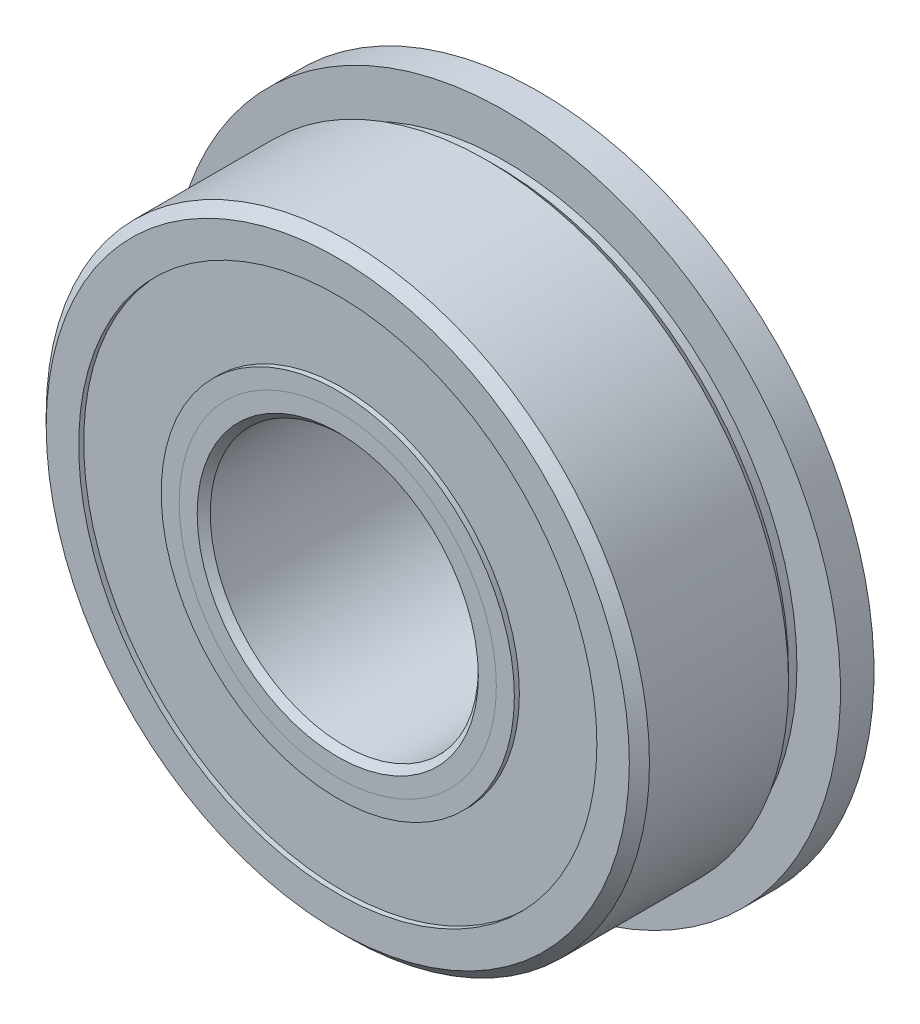
ISO-10303-21;
HEADER;
FILE_DESCRIPTION(('STEP AP214'),'2;1');
FILE_NAME('part.step','',(''),(''),'','','');
FILE_SCHEMA(('AUTOMOTIVE_DESIGN { 1 0 10303 214 1 1 1 1 }'));
ENDSEC;
DATA;
#1=APPLICATION_CONTEXT('core data for automotive mechanical design processes');
#2=APPLICATION_PROTOCOL_DEFINITION('international standard','automotive_design',2000,#1);
#3=PRODUCT_CONTEXT('',#1,'mechanical');
#4=PRODUCT('Part','Part','',(#3));
#5=PRODUCT_RELATED_PRODUCT_CATEGORY('part','',(#4));
#6=PRODUCT_DEFINITION_FORMATION('','',#4);
#7=PRODUCT_DEFINITION_CONTEXT('part definition',#1,'design');
#8=PRODUCT_DEFINITION('design','',#6,#7);
#9=PRODUCT_DEFINITION_SHAPE('','',#8);
#10=(LENGTH_UNIT() NAMED_UNIT(*) SI_UNIT(.MILLI.,.METRE.));
#11=(NAMED_UNIT(*) PLANE_ANGLE_UNIT() SI_UNIT($,.RADIAN.));
#12=(NAMED_UNIT(*) SI_UNIT($,.STERADIAN.) SOLID_ANGLE_UNIT());
#13=UNCERTAINTY_MEASURE_WITH_UNIT(LENGTH_MEASURE(1.E-05),#10,'distance_accuracy_value','');
#14=(GEOMETRIC_REPRESENTATION_CONTEXT(3) GLOBAL_UNCERTAINTY_ASSIGNED_CONTEXT((#13)) GLOBAL_UNIT_ASSIGNED_CONTEXT((#10,
#11,#12)) REPRESENTATION_CONTEXT('',''));
#15=CARTESIAN_POINT('',(0.,0.,0.));
#16=DIRECTION('',(0.,0.,1.));
#17=DIRECTION('',(1.,0.,0.));
#18=AXIS2_PLACEMENT_3D('',#15,#16,#17);
#19=CARTESIAN_POINT('',(0.,0.,4.7625));
#20=DIRECTION('',(0.,0.,1.));
#21=DIRECTION('',(1.,0.,0.));
#22=AXIS2_PLACEMENT_3D('',#19,#20,#21);
#23=CYLINDRICAL_SURFACE('',#22,8.7376);
#24=CARTESIAN_POINT('',(0.,0.,-3.35017734788581));
#25=DIRECTION('',(0.,0.,1.));
#26=DIRECTION('',(1.,0.,0.));
#27=AXIS2_PLACEMENT_3D('',#24,#25,#26);
#28=CIRCLE('',#27,8.7376);
#29=CARTESIAN_POINT('',(8.7376,0.,-3.35017734788581));
#30=VERTEX_POINT('',#29);
#31=EDGE_CURVE('E11',#30,#30,#28,.T.);
#32=ORIENTED_EDGE('',*,*,#31,.T.);
#33=EDGE_LOOP('',(#32));
#34=FACE_BOUND('',#33,.T.);
#35=CARTESIAN_POINT('',(0.,0.,-4.270375));
#36=DIRECTION('',(0.,0.,-1.));
#37=DIRECTION('',(-1.,0.,0.));
#38=AXIS2_PLACEMENT_3D('',#35,#36,#37);
#39=CIRCLE('',#38,8.7376);
#40=CARTESIAN_POINT('',(-8.7376,0.,-4.270375));
#41=VERTEX_POINT('',#40);
#42=EDGE_CURVE('E75',#41,#41,#39,.T.);
#43=ORIENTED_EDGE('',*,*,#42,.T.);
#44=EDGE_LOOP('',(#43));
#45=FACE_BOUND('',#44,.T.);
#46=ADVANCED_FACE('F54',(#34,#45),#23,.F.);
#47=CARTESIAN_POINT('',(0.,12.2725961538462,-4.524375));
#48=DIRECTION('',(0.,0.,1.));
#49=DIRECTION('',(1.,0.,0.));
#50=AXIS2_PLACEMENT_3D('',#47,#48,#49);
#51=PLANE('',#50);
#52=CARTESIAN_POINT('',(0.,0.,-4.524375));
#53=DIRECTION('',(0.,0.,-1.));
#54=DIRECTION('',(-1.,0.,0.));
#55=AXIS2_PLACEMENT_3D('',#52,#53,#54);
#56=CIRCLE('',#55,9.436608);
#57=CARTESIAN_POINT('',(-9.436608,0.,-4.524375));
#58=VERTEX_POINT('',#57);
#59=EDGE_CURVE('E72',#58,#58,#56,.T.);
#60=ORIENTED_EDGE('',*,*,#59,.F.);
#61=EDGE_LOOP('',(#60));
#62=FACE_BOUND('',#61,.T.);
#63=CARTESIAN_POINT('',(0.,0.,-4.524375));
#64=DIRECTION('',(0.,0.,1.));
#65=DIRECTION('',(1.,0.,0.));
#66=AXIS2_PLACEMENT_3D('',#63,#64,#65);
#67=CIRCLE('',#66,12.2725961538462);
#68=CARTESIAN_POINT('',(12.2725961538462,0.,-4.524375));
#69=VERTEX_POINT('',#68);
#70=EDGE_CURVE('E65',#69,#69,#67,.T.);
#71=ORIENTED_EDGE('',*,*,#70,.F.);
#72=EDGE_LOOP('',(#71));
#73=FACE_BOUND('',#72,.T.);
#74=ADVANCED_FACE('F56',(#62,#73),#51,.F.);
#75=CARTESIAN_POINT('',(0.,12.2725961538462,-3.35017734788581));
#76=DIRECTION('',(0.,0.,-1.));
#77=DIRECTION('',(-1.,0.,0.));
#78=AXIS2_PLACEMENT_3D('',#75,#76,#77);
#79=PLANE('',#78);
#80=ORIENTED_EDGE('',*,*,#31,.F.);
#81=EDGE_LOOP('',(#80));
#82=FACE_BOUND('',#81,.T.);
#83=CARTESIAN_POINT('',(0.,0.,-3.35017734788581));
#84=DIRECTION('',(0.,0.,1.));
#85=DIRECTION('',(1.,0.,0.));
#86=AXIS2_PLACEMENT_3D('',#83,#84,#85);
#87=CIRCLE('',#86,12.2725961538462);
#88=CARTESIAN_POINT('',(12.2725961538462,0.,-3.35017734788581));
#89=VERTEX_POINT('',#88);
#90=EDGE_CURVE('E61',#89,#89,#87,.T.);
#91=ORIENTED_EDGE('',*,*,#90,.T.);
#92=EDGE_LOOP('',(#91));
#93=FACE_BOUND('',#92,.T.);
#94=ADVANCED_FACE('F97',(#82,#93),#79,.F.);
#95=CARTESIAN_POINT('',(0.,0.,4.7625));
#96=DIRECTION('',(0.,0.,1.));
#97=DIRECTION('',(1.,0.,0.));
#98=AXIS2_PLACEMENT_3D('',#95,#96,#97);
#99=CYLINDRICAL_SURFACE('',#98,12.2725961538462);
#100=ORIENTED_EDGE('',*,*,#90,.F.);
#101=EDGE_LOOP('',(#100));
#102=FACE_BOUND('',#101,.T.);
#103=ORIENTED_EDGE('',*,*,#70,.T.);
#104=EDGE_LOOP('',(#103));
#105=FACE_BOUND('',#104,.T.);
#106=ADVANCED_FACE('F91',(#102,#105),#99,.T.);
#107=CARTESIAN_POINT('',(0.,0.,-4.270375));
#108=DIRECTION('',(0.,0.,-1.));
#109=DIRECTION('',(-1.,0.,0.));
#110=AXIS2_PLACEMENT_3D('',#107,#108,#109);
#111=CYLINDRICAL_SURFACE('',#110,9.436608);
#112=CARTESIAN_POINT('',(0.,0.,-4.270375));
#113=DIRECTION('',(0.,0.,-1.));
#114=DIRECTION('',(-1.,0.,0.));
#115=AXIS2_PLACEMENT_3D('',#112,#113,#114);
#116=CIRCLE('',#115,9.436608);
#117=CARTESIAN_POINT('',(-9.436608,0.,-4.270375));
#118=VERTEX_POINT('',#117);
#119=EDGE_CURVE('E69',#118,#118,#116,.T.);
#120=ORIENTED_EDGE('',*,*,#119,.F.);
#121=EDGE_LOOP('',(#120));
#122=FACE_BOUND('',#121,.T.);
#123=ORIENTED_EDGE('',*,*,#59,.T.);
#124=EDGE_LOOP('',(#123));
#125=FACE_BOUND('',#124,.T.);
#126=ADVANCED_FACE('F85',(#122,#125),#111,.F.);
#127=CARTESIAN_POINT('',(0.,0.,-4.270375));
#128=DIRECTION('',(0.,0.,-1.));
#129=DIRECTION('',(-1.,0.,0.));
#130=AXIS2_PLACEMENT_3D('',#127,#128,#129);
#131=PLANE('',#130);
#132=ORIENTED_EDGE('',*,*,#42,.F.);
#133=EDGE_LOOP('',(#132));
#134=FACE_BOUND('',#133,.T.);
#135=ORIENTED_EDGE('',*,*,#119,.T.);
#136=EDGE_LOOP('',(#135));
#137=FACE_BOUND('',#136,.T.);
#138=ADVANCED_FACE('F82',(#134,#137),#131,.T.);
#139=CLOSED_SHELL('',(#46,#74,#94,#106,#126,#138));
#140=MANIFOLD_SOLID_BREP('B2',#139);
#141=CARTESIAN_POINT('',(0.,12.2725961538462,4.524375));
#142=DIRECTION('',(0.,0.,-1.));
#143=DIRECTION('',(-1.,0.,0.));
#144=AXIS2_PLACEMENT_3D('',#141,#142,#143);
#145=PLANE('',#144);
#146=CARTESIAN_POINT('',(0.,0.,4.524375));
#147=DIRECTION('',(0.,0.,1.));
#148=DIRECTION('',(1.,0.,0.));
#149=AXIS2_PLACEMENT_3D('',#146,#147,#148);
#150=CIRCLE('',#149,8.36490384615385);
#151=CARTESIAN_POINT('',(8.36490384615385,0.,4.524375));
#152=VERTEX_POINT('',#151);
#153=EDGE_CURVE('E53',#152,#152,#150,.T.);
#154=ORIENTED_EDGE('',*,*,#153,.F.);
#155=EDGE_LOOP('',(#154));
#156=FACE_BOUND('',#155,.T.);
#157=CARTESIAN_POINT('',(0.,0.,4.524375));
#158=DIRECTION('',(0.,0.,1.));
#159=DIRECTION('',(1.,0.,0.));
#160=AXIS2_PLACEMENT_3D('',#157,#158,#159);
#161=CIRCLE('',#160,12.2725961538462);
#162=CARTESIAN_POINT('',(12.2725961538462,0.,4.524375));
#163=VERTEX_POINT('',#162);
#164=EDGE_CURVE('E182',#163,#163,#161,.T.);
#165=ORIENTED_EDGE('',*,*,#164,.T.);
#166=EDGE_LOOP('',(#165));
#167=FACE_BOUND('',#166,.T.);
#168=ADVANCED_FACE('F168',(#156,#167),#145,.F.);
#169=CARTESIAN_POINT('',(0.,0.,4.7625));
#170=DIRECTION('',(0.,0.,1.));
#171=DIRECTION('',(1.,0.,0.));
#172=AXIS2_PLACEMENT_3D('',#169,#170,#171);
#173=CYLINDRICAL_SURFACE('',#172,8.36490384615385);
#174=CARTESIAN_POINT('',(0.,0.,3.3501773478858));
#175=DIRECTION('',(0.,0.,1.));
#176=DIRECTION('',(1.,0.,0.));
#177=AXIS2_PLACEMENT_3D('',#174,#175,#176);
#178=CIRCLE('',#177,8.36490384615385);
#179=CARTESIAN_POINT('',(8.36490384615385,0.,3.3501773478858));
#180=VERTEX_POINT('',#179);
#181=EDGE_CURVE('E174',#180,#180,#178,.T.);
#182=ORIENTED_EDGE('',*,*,#181,.F.);
#183=EDGE_LOOP('',(#182));
#184=FACE_BOUND('',#183,.T.);
#185=ORIENTED_EDGE('',*,*,#153,.T.);
#186=EDGE_LOOP('',(#185));
#187=FACE_BOUND('',#186,.T.);
#188=ADVANCED_FACE('F197',(#184,#187),#173,.F.);
#189=CARTESIAN_POINT('',(0.,12.2725961538462,3.3501773478858));
#190=DIRECTION('',(0.,0.,1.));
#191=DIRECTION('',(1.,0.,0.));
#192=AXIS2_PLACEMENT_3D('',#189,#190,#191);
#193=PLANE('',#192);
#194=CARTESIAN_POINT('',(0.,0.,3.35017734788581));
#195=DIRECTION('',(0.,0.,1.));
#196=DIRECTION('',(1.,0.,0.));
#197=AXIS2_PLACEMENT_3D('',#194,#195,#196);
#198=CIRCLE('',#197,12.2725961538462);
#199=CARTESIAN_POINT('',(12.2725961538462,0.,3.35017734788581));
#200=VERTEX_POINT('',#199);
#201=EDGE_CURVE('E178',#200,#200,#198,.T.);
#202=ORIENTED_EDGE('',*,*,#201,.F.);
#203=EDGE_LOOP('',(#202));
#204=FACE_BOUND('',#203,.T.);
#205=ORIENTED_EDGE('',*,*,#181,.T.);
#206=EDGE_LOOP('',(#205));
#207=FACE_BOUND('',#206,.T.);
#208=ADVANCED_FACE('F192',(#204,#207),#193,.F.);
#209=CARTESIAN_POINT('',(0.,0.,4.7625));
#210=DIRECTION('',(0.,0.,1.));
#211=DIRECTION('',(1.,0.,0.));
#212=AXIS2_PLACEMENT_3D('',#209,#210,#211);
#213=CYLINDRICAL_SURFACE('',#212,12.2725961538462);
#214=ORIENTED_EDGE('',*,*,#164,.F.);
#215=EDGE_LOOP('',(#214));
#216=FACE_BOUND('',#215,.T.);
#217=ORIENTED_EDGE('',*,*,#201,.T.);
#218=EDGE_LOOP('',(#217));
#219=FACE_BOUND('',#218,.T.);
#220=ADVANCED_FACE('F189',(#216,#219),#213,.T.);
#221=CLOSED_SHELL('',(#168,#188,#208,#220));
#222=MANIFOLD_SOLID_BREP('B6',#221);
#223=CARTESIAN_POINT('',(-5.15937499999989,8.93629963530074,0.));
#224=DIRECTION('',(0.,0.,1.));
#225=DIRECTION('',(-0.499999999999989,0.866025403784445,0.));
#226=AXIS2_PLACEMENT_3D('',#223,#224,#225);
#227=SPHERICAL_SURFACE('',#226,3.3501773478858);
#228=CARTESIAN_POINT('',(-5.15937499999989,8.93629963530074,3.3501773478858));
#229=VERTEX_POINT('',#228);
#230=VERTEX_LOOP('',#229);
#231=FACE_BOUND('',#230,.T.);
#232=ADVANCED_FACE('F234',(#231),#227,.T.);
#233=CLOSED_SHELL('',(#232));
#234=MANIFOLD_SOLID_BREP('B48',#233);
#235=CARTESIAN_POINT('',(-8.93629963530062,5.1593750000001,0.));
#236=DIRECTION('',(0.,0.,1.));
#237=DIRECTION('',(-0.866025403784433,0.50000000000001,0.));
#238=AXIS2_PLACEMENT_3D('',#235,#236,#237);
#239=SPHERICAL_SURFACE('',#238,3.3501773478858);
#240=CARTESIAN_POINT('',(-8.93629963530062,5.1593750000001,3.3501773478858));
#241=VERTEX_POINT('',#240);
#242=VERTEX_LOOP('',#241);
#243=FACE_BOUND('',#242,.T.);
#244=ADVANCED_FACE('F273',(#243),#239,.T.);
#245=CLOSED_SHELL('',(#244));
#246=MANIFOLD_SOLID_BREP('B164',#245);
#247=CARTESIAN_POINT('',(-10.31875,1.08083169195563E-13,0.));
#248=DIRECTION('',(0.,0.,1.));
#249=DIRECTION('',(-1.,0.,0.));
#250=AXIS2_PLACEMENT_3D('',#247,#248,#249);
#251=SPHERICAL_SURFACE('',#250,3.3501773478858);
#252=CARTESIAN_POINT('',(-10.31875,1.08083169195563E-13,3.3501773478858));
#253=VERTEX_POINT('',#252);
#254=VERTEX_LOOP('',#253);
#255=FACE_BOUND('',#254,.T.);
#256=ADVANCED_FACE('F312',(#255),#251,.T.);
#257=CLOSED_SHELL('',(#256));
#258=MANIFOLD_SOLID_BREP('B230',#257);
#259=CARTESIAN_POINT('',(-8.93629963530072,-5.15937499999992,0.));
#260=DIRECTION('',(0.,0.,1.));
#261=DIRECTION('',(-0.866025403784443,-0.499999999999992,0.));
#262=AXIS2_PLACEMENT_3D('',#259,#260,#261);
#263=SPHERICAL_SURFACE('',#262,3.3501773478858);
#264=CARTESIAN_POINT('',(-8.93629963530072,-5.15937499999992,3.3501773478858));
#265=VERTEX_POINT('',#264);
#266=VERTEX_LOOP('',#265);
#267=FACE_BOUND('',#266,.T.);
#268=ADVANCED_FACE('F351',(#267),#263,.T.);
#269=CLOSED_SHELL('',(#268));
#270=MANIFOLD_SOLID_BREP('B269',#269);
#271=CARTESIAN_POINT('',(-5.15937500000007,-8.93629963530064,0.));
#272=DIRECTION('',(0.,0.,1.));
#273=DIRECTION('',(-0.500000000000007,-0.866025403784435,0.));
#274=AXIS2_PLACEMENT_3D('',#271,#272,#273);
#275=SPHERICAL_SURFACE('',#274,3.3501773478858);
#276=CARTESIAN_POINT('',(-5.15937500000007,-8.93629963530064,3.3501773478858));
#277=VERTEX_POINT('',#276);
#278=VERTEX_LOOP('',#277);
#279=FACE_BOUND('',#278,.T.);
#280=ADVANCED_FACE('F390',(#279),#275,.T.);
#281=CLOSED_SHELL('',(#280));
#282=MANIFOLD_SOLID_BREP('B308',#281);
#283=CARTESIAN_POINT('',(0.,-10.31875,0.));
#284=DIRECTION('',(0.,0.,1.));
#285=DIRECTION('',(0.,-1.,0.));
#286=AXIS2_PLACEMENT_3D('',#283,#284,#285);
#287=SPHERICAL_SURFACE('',#286,3.3501773478858);
#288=CARTESIAN_POINT('',(0.,-10.31875,3.3501773478858));
#289=VERTEX_POINT('',#288);
#290=VERTEX_LOOP('',#289);
#291=FACE_BOUND('',#290,.T.);
#292=ADVANCED_FACE('F431',(#291),#287,.T.);
#293=CLOSED_SHELL('',(#292));
#294=MANIFOLD_SOLID_BREP('B347',#293);
#295=CARTESIAN_POINT('',(5.15937499999995,-8.93629963530071,0.));
#296=DIRECTION('',(0.,0.,1.));
#297=DIRECTION('',(0.499999999999995,-0.866025403784442,0.));
#298=AXIS2_PLACEMENT_3D('',#295,#296,#297);
#299=SPHERICAL_SURFACE('',#298,3.3501773478858);
#300=CARTESIAN_POINT('',(5.15937499999995,-8.93629963530071,3.3501773478858));
#301=VERTEX_POINT('',#300);
#302=VERTEX_LOOP('',#301);
#303=FACE_BOUND('',#302,.T.);
#304=ADVANCED_FACE('F470',(#303),#299,.T.);
#305=CLOSED_SHELL('',(#304));
#306=MANIFOLD_SOLID_BREP('B386',#305);
#307=CARTESIAN_POINT('',(8.93629963530065,-5.15937500000004,0.));
#308=DIRECTION('',(0.,0.,1.));
#309=DIRECTION('',(0.866025403784436,-0.500000000000004,0.));
#310=AXIS2_PLACEMENT_3D('',#307,#308,#309);
#311=SPHERICAL_SURFACE('',#310,3.3501773478858);
#312=CARTESIAN_POINT('',(8.93629963530065,-5.15937500000004,3.3501773478858));
#313=VERTEX_POINT('',#312);
#314=VERTEX_LOOP('',#313);
#315=FACE_BOUND('',#314,.T.);
#316=ADVANCED_FACE('F509',(#315),#311,.T.);
#317=CLOSED_SHELL('',(#316));
#318=MANIFOLD_SOLID_BREP('B427',#317);
#319=CARTESIAN_POINT('',(10.31875,0.,0.));
#320=DIRECTION('',(0.,0.,1.));
#321=DIRECTION('',(1.,0.,0.));
#322=AXIS2_PLACEMENT_3D('',#319,#320,#321);
#323=SPHERICAL_SURFACE('',#322,3.3501773478858);
#324=CARTESIAN_POINT('',(10.31875,0.,3.3501773478858));
#325=VERTEX_POINT('',#324);
#326=VERTEX_LOOP('',#325);
#327=FACE_BOUND('',#326,.T.);
#328=ADVANCED_FACE('F548',(#327),#323,.T.);
#329=CLOSED_SHELL('',(#328));
#330=MANIFOLD_SOLID_BREP('B466',#329);
#331=CARTESIAN_POINT('',(8.93629963530069,5.15937499999998,0.));
#332=DIRECTION('',(0.,0.,1.));
#333=DIRECTION('',(0.86602540378444,0.499999999999998,0.));
#334=AXIS2_PLACEMENT_3D('',#331,#332,#333);
#335=SPHERICAL_SURFACE('',#334,3.3501773478858);
#336=CARTESIAN_POINT('',(8.93629963530069,5.15937499999998,3.3501773478858));
#337=VERTEX_POINT('',#336);
#338=VERTEX_LOOP('',#337);
#339=FACE_BOUND('',#338,.T.);
#340=ADVANCED_FACE('F587',(#339),#335,.T.);
#341=CLOSED_SHELL('',(#340));
#342=MANIFOLD_SOLID_BREP('B505',#341);
#343=CARTESIAN_POINT('',(5.15937500000001,8.93629963530067,0.));
#344=DIRECTION('',(0.,0.,1.));
#345=DIRECTION('',(0.500000000000001,0.866025403784438,0.));
#346=AXIS2_PLACEMENT_3D('',#343,#344,#345);
#347=SPHERICAL_SURFACE('',#346,3.3501773478858);
#348=CARTESIAN_POINT('',(5.15937500000001,8.93629963530067,3.3501773478858));
#349=VERTEX_POINT('',#348);
#350=VERTEX_LOOP('',#349);
#351=FACE_BOUND('',#350,.T.);
#352=ADVANCED_FACE('F626',(#351),#347,.T.);
#353=CLOSED_SHELL('',(#352));
#354=MANIFOLD_SOLID_BREP('B544',#353);
#355=CARTESIAN_POINT('',(0.,10.31875,0.));
#356=DIRECTION('',(0.,0.,1.));
#357=DIRECTION('',(0.,1.,0.));
#358=AXIS2_PLACEMENT_3D('',#355,#356,#357);
#359=SPHERICAL_SURFACE('',#358,3.3501773478858);
#360=CARTESIAN_POINT('',(0.,10.31875,3.3501773478858));
#361=VERTEX_POINT('',#360);
#362=VERTEX_LOOP('',#361);
#363=FACE_BOUND('',#362,.T.);
#364=ADVANCED_FACE('F667',(#363),#359,.T.);
#365=CLOSED_SHELL('',(#364));
#366=MANIFOLD_SOLID_BREP('B583',#365);
#367=CARTESIAN_POINT('',(0.,6.82625,-6.35));
#368=DIRECTION('',(0.,0.,1.));
#369=DIRECTION('',(1.,0.,0.));
#370=AXIS2_PLACEMENT_3D('',#367,#368,#369);
#371=PLANE('',#370);
#372=CARTESIAN_POINT('',(0.,0.,-6.35));
#373=DIRECTION('',(0.,0.,1.));
#374=DIRECTION('',(1.,0.,0.));
#375=AXIS2_PLACEMENT_3D('',#372,#373,#374);
#376=CIRCLE('',#375,6.82625);
#377=CARTESIAN_POINT('',(6.82625,0.,-6.35));
#378=VERTEX_POINT('',#377);
#379=EDGE_CURVE('E714',#378,#378,#376,.T.);
#380=ORIENTED_EDGE('',*,*,#379,.T.);
#381=EDGE_LOOP('',(#380));
#382=FACE_BOUND('',#381,.T.);
#383=CARTESIAN_POINT('',(0.,0.,-6.35));
#384=DIRECTION('',(0.,0.,-1.));
#385=DIRECTION('',(-1.,0.,0.));
#386=AXIS2_PLACEMENT_3D('',#383,#384,#385);
#387=CIRCLE('',#386,7.607173);
#388=CARTESIAN_POINT('',(-7.607173,0.,-6.35));
#389=VERTEX_POINT('',#388);
#390=EDGE_CURVE('E733',#389,#389,#387,.T.);
#391=ORIENTED_EDGE('',*,*,#390,.T.);
#392=EDGE_LOOP('',(#391));
#393=FACE_BOUND('',#392,.T.);
#394=ADVANCED_FACE('F688',(#382,#393),#371,.F.);
#395=CARTESIAN_POINT('',(0.,7.51209508610547,4.7625));
#396=DIRECTION('',(0.,0.,-1.));
#397=DIRECTION('',(-1.,0.,0.));
#398=AXIS2_PLACEMENT_3D('',#395,#396,#397);
#399=PLANE('',#398);
#400=CARTESIAN_POINT('',(0.,0.,4.7625));
#401=DIRECTION('',(0.,0.,1.));
#402=DIRECTION('',(1.,0.,0.));
#403=AXIS2_PLACEMENT_3D('',#400,#401,#402);
#404=CIRCLE('',#403,6.6592863260571);
#405=CARTESIAN_POINT('',(6.6592863260571,0.,4.7625));
#406=VERTEX_POINT('',#405);
#407=EDGE_CURVE('E723',#406,#406,#404,.T.);
#408=ORIENTED_EDGE('',*,*,#407,.F.);
#409=EDGE_LOOP('',(#408));
#410=FACE_BOUND('',#409,.T.);
#411=CARTESIAN_POINT('',(0.,0.,4.7625));
#412=DIRECTION('',(0.,0.,1.));
#413=DIRECTION('',(1.,0.,0.));
#414=AXIS2_PLACEMENT_3D('',#411,#412,#413);
#415=CIRCLE('',#414,7.51209508610547);
#416=CARTESIAN_POINT('',(7.51209508610547,0.,4.7625));
#417=VERTEX_POINT('',#416);
#418=EDGE_CURVE('E666',#417,#417,#415,.T.);
#419=ORIENTED_EDGE('',*,*,#418,.T.);
#420=EDGE_LOOP('',(#419));
#421=FACE_BOUND('',#420,.T.);
#422=ADVANCED_FACE('F690',(#410,#421),#399,.F.);
#423=CARTESIAN_POINT('',(0.,0.,3.90969123995163));
#424=DIRECTION('',(0.,0.,1.));
#425=DIRECTION('',(1.,0.,0.));
#426=AXIS2_PLACEMENT_3D('',#423,#424,#425);
#427=CONICAL_SURFACE('',#426,6.6592863260571,0.785398163397449);
#428=ORIENTED_EDGE('',*,*,#418,.F.);
#429=EDGE_LOOP('',(#428));
#430=FACE_BOUND('',#429,.T.);
#431=CARTESIAN_POINT('',(0.,0.,3.90969123995163));
#432=DIRECTION('',(0.,0.,1.));
#433=DIRECTION('',(1.,0.,0.));
#434=AXIS2_PLACEMENT_3D('',#431,#432,#433);
#435=CIRCLE('',#434,6.6592863260571);
#436=CARTESIAN_POINT('',(6.6592863260571,0.,3.90969123995163));
#437=VERTEX_POINT('',#436);
#438=EDGE_CURVE('E695',#437,#437,#435,.T.);
#439=ORIENTED_EDGE('',*,*,#438,.T.);
#440=EDGE_LOOP('',(#439));
#441=FACE_BOUND('',#440,.T.);
#442=ADVANCED_FACE('F778',(#430,#441),#427,.T.);
#443=CARTESIAN_POINT('',(0.,0.,4.7625));
#444=DIRECTION('',(0.,0.,1.));
#445=DIRECTION('',(1.,0.,0.));
#446=AXIS2_PLACEMENT_3D('',#443,#444,#445);
#447=CYLINDRICAL_SURFACE('',#446,6.6592863260571);
#448=ORIENTED_EDGE('',*,*,#438,.F.);
#449=EDGE_LOOP('',(#448));
#450=FACE_BOUND('',#449,.T.);
#451=CARTESIAN_POINT('',(0.,0.,0.));
#452=DIRECTION('',(0.,0.,1.));
#453=DIRECTION('',(1.,0.,0.));
#454=AXIS2_PLACEMENT_3D('',#451,#452,#453);
#455=CIRCLE('',#454,6.6592863260571);
#456=CARTESIAN_POINT('',(6.6592863260571,0.,0.));
#457=VERTEX_POINT('',#456);
#458=EDGE_CURVE('E699',#457,#457,#455,.T.);
#459=ORIENTED_EDGE('',*,*,#458,.T.);
#460=EDGE_LOOP('',(#459));
#461=FACE_BOUND('',#460,.T.);
#462=ADVANCED_FACE('F847',(#450,#461),#447,.T.);
#463=CARTESIAN_POINT('',(0.,6.6592863260571,0.));
#464=DIRECTION('',(0.,0.,-1.));
#465=DIRECTION('',(-1.,0.,0.));
#466=AXIS2_PLACEMENT_3D('',#463,#464,#465);
#467=PLANE('',#466);
#468=ORIENTED_EDGE('',*,*,#458,.F.);
#469=EDGE_LOOP('',(#468));
#470=FACE_BOUND('',#469,.T.);
#471=CARTESIAN_POINT('',(0.,0.,0.));
#472=DIRECTION('',(0.,0.,1.));
#473=DIRECTION('',(1.,0.,0.));
#474=AXIS2_PLACEMENT_3D('',#471,#472,#473);
#475=CIRCLE('',#474,6.9685726521142);
#476=CARTESIAN_POINT('',(6.9685726521142,0.,0.));
#477=VERTEX_POINT('',#476);
#478=EDGE_CURVE('E703',#477,#477,#475,.T.);
#479=ORIENTED_EDGE('',*,*,#478,.T.);
#480=EDGE_LOOP('',(#479));
#481=FACE_BOUND('',#480,.T.);
#482=ADVANCED_FACE('F769',(#470,#481),#467,.F.);
#483=CARTESIAN_POINT('',(0.,0.,0.));
#484=DIRECTION('',(0.,0.,1.));
#485=DIRECTION('',(1.,0.,0.));
#486=AXIS2_PLACEMENT_3D('',#483,#484,#485);
#487=TOROIDAL_SURFACE('',#486,10.31875,3.3501773478858);
#488=ORIENTED_EDGE('',*,*,#478,.F.);
#489=EDGE_LOOP('',(#488));
#490=FACE_BOUND('',#489,.T.);
#491=CARTESIAN_POINT('',(0.,0.,-2.9535830680357));
#492=DIRECTION('',(0.,0.,1.));
#493=DIRECTION('',(1.,0.,0.));
#494=AXIS2_PLACEMENT_3D('',#491,#492,#493);
#495=CIRCLE('',#494,8.7376);
#496=CARTESIAN_POINT('',(8.7376,0.,-2.9535830680357));
#497=VERTEX_POINT('',#496);
#498=EDGE_CURVE('E708',#497,#497,#495,.T.);
#499=ORIENTED_EDGE('',*,*,#498,.T.);
#500=EDGE_LOOP('',(#499));
#501=FACE_BOUND('',#500,.T.);
#502=ADVANCED_FACE('F764',(#490,#501),#487,.F.);
#503=CARTESIAN_POINT('',(0.,0.,4.7625));
#504=DIRECTION('',(0.,0.,1.));
#505=DIRECTION('',(1.,0.,0.));
#506=AXIS2_PLACEMENT_3D('',#503,#504,#505);
#507=CYLINDRICAL_SURFACE('',#506,8.7376);
#508=ORIENTED_EDGE('',*,*,#498,.F.);
#509=EDGE_LOOP('',(#508));
#510=FACE_BOUND('',#509,.T.);
#511=CARTESIAN_POINT('',(0.,0.,-6.35));
#512=DIRECTION('',(0.,0.,1.));
#513=DIRECTION('',(1.,0.,0.));
#514=AXIS2_PLACEMENT_3D('',#511,#512,#513);
#515=CIRCLE('',#514,8.7376);
#516=CARTESIAN_POINT('',(8.7376,0.,-6.35));
#517=VERTEX_POINT('',#516);
#518=EDGE_CURVE('E711',#517,#517,#515,.T.);
#519=ORIENTED_EDGE('',*,*,#518,.T.);
#520=EDGE_LOOP('',(#519));
#521=FACE_BOUND('',#520,.T.);
#522=ADVANCED_FACE('F759',(#510,#521),#507,.T.);
#523=CARTESIAN_POINT('',(0.,0.,-6.35));
#524=DIRECTION('',(0.,0.,-1.));
#525=DIRECTION('',(-1.,0.,0.));
#526=AXIS2_PLACEMENT_3D('',#523,#524,#525);
#527=CIRCLE('',#526,7.956677);
#528=CARTESIAN_POINT('',(-7.956677,0.,-6.35));
#529=VERTEX_POINT('',#528);
#530=EDGE_CURVE('E727',#529,#529,#527,.T.);
#531=ORIENTED_EDGE('',*,*,#530,.F.);
#532=EDGE_LOOP('',(#531));
#533=FACE_BOUND('',#532,.T.);
#534=ORIENTED_EDGE('',*,*,#518,.F.);
#535=EDGE_LOOP('',(#534));
#536=FACE_BOUND('',#535,.T.);
#537=ADVANCED_FACE('F755',(#533,#536),#371,.F.);
#538=CARTESIAN_POINT('',(0.,0.,-5.87375));
#539=DIRECTION('',(0.,0.,-1.));
#540=DIRECTION('',(-1.,0.,0.));
#541=AXIS2_PLACEMENT_3D('',#538,#539,#540);
#542=CONICAL_SURFACE('',#541,6.35,0.785398163397445);
#543=ORIENTED_EDGE('',*,*,#379,.F.);
#544=EDGE_LOOP('',(#543));
#545=FACE_BOUND('',#544,.T.);
#546=CARTESIAN_POINT('',(0.,0.,-5.87375));
#547=DIRECTION('',(0.,0.,1.));
#548=DIRECTION('',(1.,0.,0.));
#549=AXIS2_PLACEMENT_3D('',#546,#547,#548);
#550=CIRCLE('',#549,6.35);
#551=CARTESIAN_POINT('',(6.35,0.,-5.87375));
#552=VERTEX_POINT('',#551);
#553=EDGE_CURVE('E717',#552,#552,#550,.T.);
#554=ORIENTED_EDGE('',*,*,#553,.T.);
#555=EDGE_LOOP('',(#554));
#556=FACE_BOUND('',#555,.T.);
#557=ADVANCED_FACE('F758',(#545,#556),#542,.F.);
#558=CARTESIAN_POINT('',(0.,0.,4.7625));
#559=DIRECTION('',(0.,0.,1.));
#560=DIRECTION('',(1.,0.,0.));
#561=AXIS2_PLACEMENT_3D('',#558,#559,#560);
#562=CYLINDRICAL_SURFACE('',#561,6.35);
#563=ORIENTED_EDGE('',*,*,#553,.F.);
#564=EDGE_LOOP('',(#563));
#565=FACE_BOUND('',#564,.T.);
#566=CARTESIAN_POINT('',(0.,0.,4.4532136739429));
#567=DIRECTION('',(0.,0.,1.));
#568=DIRECTION('',(1.,0.,0.));
#569=AXIS2_PLACEMENT_3D('',#566,#567,#568);
#570=CIRCLE('',#569,6.35);
#571=CARTESIAN_POINT('',(6.35,0.,4.4532136739429));
#572=VERTEX_POINT('',#571);
#573=EDGE_CURVE('E720',#572,#572,#570,.T.);
#574=ORIENTED_EDGE('',*,*,#573,.T.);
#575=EDGE_LOOP('',(#574));
#576=FACE_BOUND('',#575,.T.);
#577=ADVANCED_FACE('F783',(#565,#576),#562,.F.);
#578=CARTESIAN_POINT('',(0.,0.,4.7625));
#579=DIRECTION('',(0.,0.,1.));
#580=DIRECTION('',(1.,0.,0.));
#581=AXIS2_PLACEMENT_3D('',#578,#579,#580);
#582=CONICAL_SURFACE('',#581,6.6592863260571,0.78539816339745);
#583=ORIENTED_EDGE('',*,*,#573,.F.);
#584=EDGE_LOOP('',(#583));
#585=FACE_BOUND('',#584,.T.);
#586=ORIENTED_EDGE('',*,*,#407,.T.);
#587=EDGE_LOOP('',(#586));
#588=FACE_BOUND('',#587,.T.);
#589=ADVANCED_FACE('F751',(#585,#588),#582,.F.);
#590=CARTESIAN_POINT('',(0.,0.,-6.223));
#591=DIRECTION('',(0.,0.,-1.));
#592=DIRECTION('',(-1.,0.,0.));
#593=AXIS2_PLACEMENT_3D('',#590,#591,#592);
#594=CYLINDRICAL_SURFACE('',#593,7.956677);
#595=CARTESIAN_POINT('',(0.,0.,-6.223));
#596=DIRECTION('',(0.,0.,-1.));
#597=DIRECTION('',(-1.,0.,0.));
#598=AXIS2_PLACEMENT_3D('',#595,#596,#597);
#599=CIRCLE('',#598,7.956677);
#600=CARTESIAN_POINT('',(-7.956677,0.,-6.223));
#601=VERTEX_POINT('',#600);
#602=EDGE_CURVE('E726',#601,#601,#599,.T.);
#603=ORIENTED_EDGE('',*,*,#602,.F.);
#604=EDGE_LOOP('',(#603));
#605=FACE_BOUND('',#604,.T.);
#606=ORIENTED_EDGE('',*,*,#530,.T.);
#607=EDGE_LOOP('',(#606));
#608=FACE_BOUND('',#607,.T.);
#609=ADVANCED_FACE('F745',(#605,#608),#594,.F.);
#610=CARTESIAN_POINT('',(0.,0.,-6.223));
#611=DIRECTION('',(0.,0.,-1.));
#612=DIRECTION('',(-1.,0.,0.));
#613=AXIS2_PLACEMENT_3D('',#610,#611,#612);
#614=PLANE('',#613);
#615=CARTESIAN_POINT('',(0.,0.,-6.223));
#616=DIRECTION('',(0.,0.,-1.));
#617=DIRECTION('',(-1.,0.,0.));
#618=AXIS2_PLACEMENT_3D('',#615,#616,#617);
#619=CIRCLE('',#618,7.607173);
#620=CARTESIAN_POINT('',(-7.607173,0.,-6.223));
#621=VERTEX_POINT('',#620);
#622=EDGE_CURVE('E730',#621,#621,#619,.T.);
#623=ORIENTED_EDGE('',*,*,#622,.F.);
#624=EDGE_LOOP('',(#623));
#625=FACE_BOUND('',#624,.T.);
#626=ORIENTED_EDGE('',*,*,#602,.T.);
#627=EDGE_LOOP('',(#626));
#628=FACE_BOUND('',#627,.T.);
#629=ADVANCED_FACE('F742',(#625,#628),#614,.T.);
#630=CARTESIAN_POINT('',(0.,0.,-6.223));
#631=DIRECTION('',(0.,0.,-1.));
#632=DIRECTION('',(-1.,0.,0.));
#633=AXIS2_PLACEMENT_3D('',#630,#631,#632);
#634=CYLINDRICAL_SURFACE('',#633,7.607173);
#635=ORIENTED_EDGE('',*,*,#622,.T.);
#636=EDGE_LOOP('',(#635));
#637=FACE_BOUND('',#636,.T.);
#638=ORIENTED_EDGE('',*,*,#390,.F.);
#639=EDGE_LOOP('',(#638));
#640=FACE_BOUND('',#639,.T.);
#641=ADVANCED_FACE('F739',(#637,#640),#634,.T.);
#642=CLOSED_SHELL('',(#394,#422,#442,#462,#482,#502,#522,#537,#557,#577,#589,#609,#629,#641));
#643=MANIFOLD_SOLID_BREP('B622',#642);
#644=CARTESIAN_POINT('',(0.,8.36490384615385,4.7625));
#645=DIRECTION('',(0.,0.,-1.));
#646=DIRECTION('',(-1.,0.,0.));
#647=AXIS2_PLACEMENT_3D('',#644,#645,#646);
#648=PLANE('',#647);
#649=CARTESIAN_POINT('',(0.,0.,4.7625));
#650=DIRECTION('',(0.,0.,1.));
#651=DIRECTION('',(1.,0.,0.));
#652=AXIS2_PLACEMENT_3D('',#649,#650,#651);
#653=CIRCLE('',#652,7.51209508610547);
#654=CARTESIAN_POINT('',(7.51209508610547,0.,4.7625));
#655=VERTEX_POINT('',#654);
#656=EDGE_CURVE('E687',#655,#655,#653,.T.);
#657=ORIENTED_EDGE('',*,*,#656,.F.);
#658=EDGE_LOOP('',(#657));
#659=FACE_BOUND('',#658,.T.);
#660=CARTESIAN_POINT('',(0.,0.,4.7625));
#661=DIRECTION('',(0.,0.,1.));
#662=DIRECTION('',(1.,0.,0.));
#663=AXIS2_PLACEMENT_3D('',#660,#661,#662);
#664=CIRCLE('',#663,8.36490384615385);
#665=CARTESIAN_POINT('',(8.36490384615385,0.,4.7625));
#666=VERTEX_POINT('',#665);
#667=EDGE_CURVE('E916',#666,#666,#664,.T.);
#668=ORIENTED_EDGE('',*,*,#667,.T.);
#669=EDGE_LOOP('',(#668));
#670=FACE_BOUND('',#669,.T.);
#671=ADVANCED_FACE('F894',(#659,#670),#648,.F.);
#672=CARTESIAN_POINT('',(0.,0.,4.7625));
#673=DIRECTION('',(0.,0.,1.));
#674=DIRECTION('',(1.,0.,0.));
#675=AXIS2_PLACEMENT_3D('',#672,#673,#674);
#676=CONICAL_SURFACE('',#675,7.51209508610547,0.785398163397449);
#677=CARTESIAN_POINT('',(0.,0.,3.90969123995163));
#678=DIRECTION('',(0.,0.,1.));
#679=DIRECTION('',(1.,0.,0.));
#680=AXIS2_PLACEMENT_3D('',#677,#678,#679);
#681=CIRCLE('',#680,6.6592863260571);
#682=CARTESIAN_POINT('',(6.6592863260571,0.,3.90969123995163));
#683=VERTEX_POINT('',#682);
#684=EDGE_CURVE('E900',#683,#683,#681,.T.);
#685=ORIENTED_EDGE('',*,*,#684,.F.);
#686=EDGE_LOOP('',(#685));
#687=FACE_BOUND('',#686,.T.);
#688=ORIENTED_EDGE('',*,*,#656,.T.);
#689=EDGE_LOOP('',(#688));
#690=FACE_BOUND('',#689,.T.);
#691=ADVANCED_FACE('F941',(#687,#690),#676,.F.);
#692=CARTESIAN_POINT('',(0.,0.,4.7625));
#693=DIRECTION('',(0.,0.,1.));
#694=DIRECTION('',(1.,0.,0.));
#695=AXIS2_PLACEMENT_3D('',#692,#693,#694);
#696=CYLINDRICAL_SURFACE('',#695,6.6592863260571);
#697=CARTESIAN_POINT('',(0.,0.,0.));
#698=DIRECTION('',(0.,0.,1.));
#699=DIRECTION('',(1.,0.,0.));
#700=AXIS2_PLACEMENT_3D('',#697,#698,#699);
#701=CIRCLE('',#700,6.6592863260571);
#702=CARTESIAN_POINT('',(6.6592863260571,0.,0.));
#703=VERTEX_POINT('',#702);
#704=EDGE_CURVE('E904',#703,#703,#701,.T.);
#705=ORIENTED_EDGE('',*,*,#704,.F.);
#706=EDGE_LOOP('',(#705));
#707=FACE_BOUND('',#706,.T.);
#708=ORIENTED_EDGE('',*,*,#684,.T.);
#709=EDGE_LOOP('',(#708));
#710=FACE_BOUND('',#709,.T.);
#711=ADVANCED_FACE('F936',(#707,#710),#696,.F.);
#712=CARTESIAN_POINT('',(0.,6.6592863260571,0.));
#713=DIRECTION('',(0.,0.,1.));
#714=DIRECTION('',(1.,0.,0.));
#715=AXIS2_PLACEMENT_3D('',#712,#713,#714);
#716=PLANE('',#715);
#717=CARTESIAN_POINT('',(0.,0.,0.));
#718=DIRECTION('',(0.,0.,1.));
#719=DIRECTION('',(1.,0.,0.));
#720=AXIS2_PLACEMENT_3D('',#717,#718,#719);
#721=CIRCLE('',#720,6.9685726521142);
#722=CARTESIAN_POINT('',(6.9685726521142,0.,0.));
#723=VERTEX_POINT('',#722);
#724=EDGE_CURVE('E908',#723,#723,#721,.T.);
#725=ORIENTED_EDGE('',*,*,#724,.F.);
#726=EDGE_LOOP('',(#725));
#727=FACE_BOUND('',#726,.T.);
#728=ORIENTED_EDGE('',*,*,#704,.T.);
#729=EDGE_LOOP('',(#728));
#730=FACE_BOUND('',#729,.T.);
#731=ADVANCED_FACE('F930',(#727,#730),#716,.F.);
#732=CARTESIAN_POINT('',(0.,0.,0.));
#733=DIRECTION('',(0.,0.,1.));
#734=DIRECTION('',(1.,0.,0.));
#735=AXIS2_PLACEMENT_3D('',#732,#733,#734);
#736=TOROIDAL_SURFACE('',#735,10.31875,3.3501773478858);
#737=CARTESIAN_POINT('',(0.,0.,2.72142857142857));
#738=DIRECTION('',(0.,0.,1.));
#739=DIRECTION('',(1.,0.,0.));
#740=AXIS2_PLACEMENT_3D('',#737,#738,#739);
#741=CIRCLE('',#740,8.36490384615385);
#742=CARTESIAN_POINT('',(8.36490384615385,0.,2.72142857142857));
#743=VERTEX_POINT('',#742);
#744=EDGE_CURVE('E913',#743,#743,#741,.T.);
#745=ORIENTED_EDGE('',*,*,#744,.F.);
#746=EDGE_LOOP('',(#745));
#747=FACE_BOUND('',#746,.T.);
#748=ORIENTED_EDGE('',*,*,#724,.T.);
#749=EDGE_LOOP('',(#748));
#750=FACE_BOUND('',#749,.T.);
#751=ADVANCED_FACE('F924',(#747,#750),#736,.F.);
#752=CARTESIAN_POINT('',(0.,0.,4.7625));
#753=DIRECTION('',(0.,0.,1.));
#754=DIRECTION('',(1.,0.,0.));
#755=AXIS2_PLACEMENT_3D('',#752,#753,#754);
#756=CYLINDRICAL_SURFACE('',#755,8.36490384615385);
#757=ORIENTED_EDGE('',*,*,#667,.F.);
#758=EDGE_LOOP('',(#757));
#759=FACE_BOUND('',#758,.T.);
#760=ORIENTED_EDGE('',*,*,#744,.T.);
#761=EDGE_LOOP('',(#760));
#762=FACE_BOUND('',#761,.T.);
#763=ADVANCED_FACE('F921',(#759,#762),#756,.T.);
#764=CLOSED_SHELL('',(#671,#691,#711,#731,#751,#763));
#765=MANIFOLD_SOLID_BREP('B661',#764);
#766=CARTESIAN_POINT('',(0.,0.,4.7625));
#767=DIRECTION('',(0.,0.,1.));
#768=DIRECTION('',(1.,0.,0.));
#769=AXIS2_PLACEMENT_3D('',#766,#767,#768);
#770=CYLINDRICAL_SURFACE('',#769,14.2875);
#771=CARTESIAN_POINT('',(0.,0.,4.28625));
#772=DIRECTION('',(0.,0.,1.));
#773=DIRECTION('',(1.,0.,0.));
#774=AXIS2_PLACEMENT_3D('',#771,#772,#773);
#775=CIRCLE('',#774,14.2875);
#776=CARTESIAN_POINT('',(14.2875,0.,4.28625));
#777=VERTEX_POINT('',#776);
#778=EDGE_CURVE('E997',#777,#777,#775,.T.);
#779=ORIENTED_EDGE('',*,*,#778,.F.);
#780=EDGE_LOOP('',(#779));
#781=FACE_BOUND('',#780,.T.);
#782=CARTESIAN_POINT('',(0.,0.,-2.301875));
#783=DIRECTION('',(0.,0.,1.));
#784=DIRECTION('',(1.,0.,0.));
#785=AXIS2_PLACEMENT_3D('',#782,#783,#784);
#786=CIRCLE('',#785,14.2875);
#787=CARTESIAN_POINT('',(14.2875,0.,-2.301875));
#788=VERTEX_POINT('',#787);
#789=EDGE_CURVE('E1024',#788,#788,#786,.T.);
#790=ORIENTED_EDGE('',*,*,#789,.T.);
#791=EDGE_LOOP('',(#790));
#792=FACE_BOUND('',#791,.T.);
#793=ADVANCED_FACE('F986',(#781,#792),#770,.T.);
#794=CARTESIAN_POINT('',(0.,0.,0.));
#795=DIRECTION('',(0.,0.,1.));
#796=DIRECTION('',(1.,0.,0.));
#797=AXIS2_PLACEMENT_3D('',#794,#795,#796);
#798=TOROIDAL_SURFACE('',#797,10.31875,3.3501773478858);
#799=CARTESIAN_POINT('',(0.,0.,2.72142857142857));
#800=DIRECTION('',(0.,0.,1.));
#801=DIRECTION('',(1.,0.,0.));
#802=AXIS2_PLACEMENT_3D('',#799,#800,#801);
#803=CIRCLE('',#802,12.2725961538462);
#804=CARTESIAN_POINT('',(12.2725961538462,0.,2.72142857142857));
#805=VERTEX_POINT('',#804);
#806=EDGE_CURVE('E1009',#805,#805,#803,.T.);
#807=ORIENTED_EDGE('',*,*,#806,.T.);
#808=EDGE_LOOP('',(#807));
#809=FACE_BOUND('',#808,.T.);
#810=CARTESIAN_POINT('',(0.,0.,-2.72142857142857));
#811=DIRECTION('',(0.,0.,1.));
#812=DIRECTION('',(1.,0.,0.));
#813=AXIS2_PLACEMENT_3D('',#810,#811,#812);
#814=CIRCLE('',#813,12.2725961538462);
#815=CARTESIAN_POINT('',(12.2725961538462,0.,-2.72142857142857));
#816=VERTEX_POINT('',#815);
#817=EDGE_CURVE('E893',#816,#816,#814,.T.);
#818=ORIENTED_EDGE('',*,*,#817,.F.);
#819=EDGE_LOOP('',(#818));
#820=FACE_BOUND('',#819,.T.);
#821=ADVANCED_FACE('F988',(#809,#820),#798,.F.);
#822=CARTESIAN_POINT('',(0.,0.,4.7625));
#823=DIRECTION('',(0.,0.,1.));
#824=DIRECTION('',(1.,0.,0.));
#825=AXIS2_PLACEMENT_3D('',#822,#823,#824);
#826=CYLINDRICAL_SURFACE('',#825,12.2725961538462);
#827=ORIENTED_EDGE('',*,*,#817,.T.);
#828=EDGE_LOOP('',(#827));
#829=FACE_BOUND('',#828,.T.);
#830=CARTESIAN_POINT('',(0.,0.,-4.7625));
#831=DIRECTION('',(0.,0.,1.));
#832=DIRECTION('',(1.,0.,0.));
#833=AXIS2_PLACEMENT_3D('',#830,#831,#832);
#834=CIRCLE('',#833,12.2725961538462);
#835=CARTESIAN_POINT('',(12.2725961538462,0.,-4.7625));
#836=VERTEX_POINT('',#835);
#837=EDGE_CURVE('E993',#836,#836,#834,.T.);
#838=ORIENTED_EDGE('',*,*,#837,.F.);
#839=EDGE_LOOP('',(#838));
#840=FACE_BOUND('',#839,.T.);
#841=ADVANCED_FACE('F1045',(#829,#840),#826,.F.);
#842=CARTESIAN_POINT('',(0.,0.,-4.7625));
#843=DIRECTION('',(0.,0.,-1.));
#844=DIRECTION('',(-1.,0.,0.));
#845=AXIS2_PLACEMENT_3D('',#842,#843,#844);
#846=PLANE('',#845);
#847=ORIENTED_EDGE('',*,*,#837,.T.);
#848=EDGE_LOOP('',(#847));
#849=FACE_BOUND('',#848,.T.);
#850=CARTESIAN_POINT('',(0.,0.,-4.7625));
#851=DIRECTION('',(0.,0.,-1.));
#852=DIRECTION('',(-1.,0.,0.));
#853=AXIS2_PLACEMENT_3D('',#850,#851,#852);
#854=CIRCLE('',#853,15.875);
#855=CARTESIAN_POINT('',(-15.875,0.,-4.7625));
#856=VERTEX_POINT('',#855);
#857=EDGE_CURVE('E1012',#856,#856,#854,.T.);
#858=ORIENTED_EDGE('',*,*,#857,.T.);
#859=EDGE_LOOP('',(#858));
#860=FACE_BOUND('',#859,.T.);
#861=ADVANCED_FACE('F1052',(#849,#860),#846,.T.);
#862=CARTESIAN_POINT('',(0.,0.,4.28625));
#863=DIRECTION('',(0.,0.,-1.));
#864=DIRECTION('',(-1.,0.,0.));
#865=AXIS2_PLACEMENT_3D('',#862,#863,#864);
#866=CONICAL_SURFACE('',#865,14.2875,0.785398163397447);
#867=CARTESIAN_POINT('',(0.,0.,4.7625));
#868=DIRECTION('',(0.,0.,1.));
#869=DIRECTION('',(1.,0.,0.));
#870=AXIS2_PLACEMENT_3D('',#867,#868,#869);
#871=CIRCLE('',#870,13.81125);
#872=CARTESIAN_POINT('',(13.81125,0.,4.7625));
#873=VERTEX_POINT('',#872);
#874=EDGE_CURVE('E1001',#873,#873,#871,.T.);
#875=ORIENTED_EDGE('',*,*,#874,.F.);
#876=EDGE_LOOP('',(#875));
#877=FACE_BOUND('',#876,.T.);
#878=ORIENTED_EDGE('',*,*,#778,.T.);
#879=EDGE_LOOP('',(#878));
#880=FACE_BOUND('',#879,.T.);
#881=ADVANCED_FACE('F1050',(#877,#880),#866,.T.);
#882=CARTESIAN_POINT('',(0.,0.,4.7625));
#883=DIRECTION('',(0.,0.,-1.));
#884=DIRECTION('',(-1.,0.,0.));
#885=AXIS2_PLACEMENT_3D('',#882,#883,#884);
#886=PLANE('',#885);
#887=CARTESIAN_POINT('',(0.,0.,4.7625));
#888=DIRECTION('',(0.,0.,1.));
#889=DIRECTION('',(1.,0.,0.));
#890=AXIS2_PLACEMENT_3D('',#887,#888,#889);
#891=CIRCLE('',#890,12.2725961538462);
#892=CARTESIAN_POINT('',(12.2725961538462,0.,4.7625));
#893=VERTEX_POINT('',#892);
#894=EDGE_CURVE('E1006',#893,#893,#891,.T.);
#895=ORIENTED_EDGE('',*,*,#894,.F.);
#896=EDGE_LOOP('',(#895));
#897=FACE_BOUND('',#896,.T.);
#898=ORIENTED_EDGE('',*,*,#874,.T.);
#899=EDGE_LOOP('',(#898));
#900=FACE_BOUND('',#899,.T.);
#901=ADVANCED_FACE('F1064',(#897,#900),#886,.F.);
#902=CARTESIAN_POINT('',(0.,0.,4.7625));
#903=DIRECTION('',(0.,0.,1.));
#904=DIRECTION('',(1.,0.,0.));
#905=AXIS2_PLACEMENT_3D('',#902,#903,#904);
#906=CYLINDRICAL_SURFACE('',#905,12.2725961538462);
#907=ORIENTED_EDGE('',*,*,#806,.F.);
#908=EDGE_LOOP('',(#907));
#909=FACE_BOUND('',#908,.T.);
#910=ORIENTED_EDGE('',*,*,#894,.T.);
#911=EDGE_LOOP('',(#910));
#912=FACE_BOUND('',#911,.T.);
#913=ADVANCED_FACE('F1068',(#909,#912),#906,.F.);
#914=CARTESIAN_POINT('',(0.,13.0419230769231,-3.175));
#915=DIRECTION('',(0.,0.,1.));
#916=DIRECTION('',(1.,0.,0.));
#917=AXIS2_PLACEMENT_3D('',#914,#915,#916);
#918=PLANE('',#917);
#919=CARTESIAN_POINT('',(0.,0.,-3.175));
#920=DIRECTION('',(0.,0.,-1.));
#921=DIRECTION('',(-1.,0.,0.));
#922=AXIS2_PLACEMENT_3D('',#919,#920,#921);
#923=CIRCLE('',#922,15.875);
#924=CARTESIAN_POINT('',(-15.875,0.,-3.175));
#925=VERTEX_POINT('',#924);
#926=EDGE_CURVE('E1015',#925,#925,#923,.T.);
#927=ORIENTED_EDGE('',*,*,#926,.F.);
#928=EDGE_LOOP('',(#927));
#929=FACE_BOUND('',#928,.T.);
#930=CARTESIAN_POINT('',(0.,0.,-3.175));
#931=DIRECTION('',(0.,0.,1.));
#932=DIRECTION('',(1.,0.,0.));
#933=AXIS2_PLACEMENT_3D('',#930,#931,#932);
#934=CIRCLE('',#933,13.81125);
#935=CARTESIAN_POINT('',(13.81125,0.,-3.175));
#936=VERTEX_POINT('',#935);
#937=EDGE_CURVE('E1018',#936,#936,#934,.T.);
#938=ORIENTED_EDGE('',*,*,#937,.F.);
#939=EDGE_LOOP('',(#938));
#940=FACE_BOUND('',#939,.T.);
#941=ADVANCED_FACE('F1070',(#929,#940),#918,.T.);
#942=CARTESIAN_POINT('',(0.,0.,-6.35));
#943=DIRECTION('',(0.,0.,-1.));
#944=DIRECTION('',(-1.,0.,0.));
#945=AXIS2_PLACEMENT_3D('',#942,#943,#944);
#946=CYLINDRICAL_SURFACE('',#945,15.875);
#947=ORIENTED_EDGE('',*,*,#926,.T.);
#948=EDGE_LOOP('',(#947));
#949=FACE_BOUND('',#948,.T.);
#950=ORIENTED_EDGE('',*,*,#857,.F.);
#951=EDGE_LOOP('',(#950));
#952=FACE_BOUND('',#951,.T.);
#953=ADVANCED_FACE('F1037',(#949,#952),#946,.T.);
#954=CARTESIAN_POINT('',(0.,0.,4.7625));
#955=DIRECTION('',(0.,0.,1.));
#956=DIRECTION('',(1.,0.,0.));
#957=AXIS2_PLACEMENT_3D('',#954,#955,#956);
#958=CYLINDRICAL_SURFACE('',#957,13.81125);
#959=ORIENTED_EDGE('',*,*,#937,.T.);
#960=EDGE_LOOP('',(#959));
#961=FACE_BOUND('',#960,.T.);
#962=CARTESIAN_POINT('',(0.,0.,-2.778125));
#963=DIRECTION('',(0.,0.,1.));
#964=DIRECTION('',(1.,0.,0.));
#965=AXIS2_PLACEMENT_3D('',#962,#963,#964);
#966=CIRCLE('',#965,13.81125);
#967=CARTESIAN_POINT('',(13.81125,0.,-2.778125));
#968=VERTEX_POINT('',#967);
#969=EDGE_CURVE('E1021',#968,#968,#966,.T.);
#970=ORIENTED_EDGE('',*,*,#969,.F.);
#971=EDGE_LOOP('',(#970));
#972=FACE_BOUND('',#971,.T.);
#973=ADVANCED_FACE('F1031',(#961,#972),#958,.T.);
#974=CARTESIAN_POINT('',(0.,0.,-2.301875));
#975=DIRECTION('',(0.,0.,1.));
#976=DIRECTION('',(1.,0.,0.));
#977=AXIS2_PLACEMENT_3D('',#974,#975,#976);
#978=CONICAL_SURFACE('',#977,14.2875,0.785398163397445);
#979=ORIENTED_EDGE('',*,*,#969,.T.);
#980=EDGE_LOOP('',(#979));
#981=FACE_BOUND('',#980,.T.);
#982=ORIENTED_EDGE('',*,*,#789,.F.);
#983=EDGE_LOOP('',(#982));
#984=FACE_BOUND('',#983,.T.);
#985=ADVANCED_FACE('F1029',(#981,#984),#978,.T.);
#986=CLOSED_SHELL('',(#793,#821,#841,#861,#881,#901,#913,#941,#953,#973,#985));
#987=MANIFOLD_SOLID_BREP('B682',#986);
#988=ADVANCED_BREP_SHAPE_REPRESENTATION('',(#18,#140,#222,#234,#246,#258,#270,#282,#294,#306,
#318,#330,#342,#354,#366,#643,#765,#987),#14);
#989=SHAPE_DEFINITION_REPRESENTATION(#9,#988);
ENDSEC;
END-ISO-10303-21;
